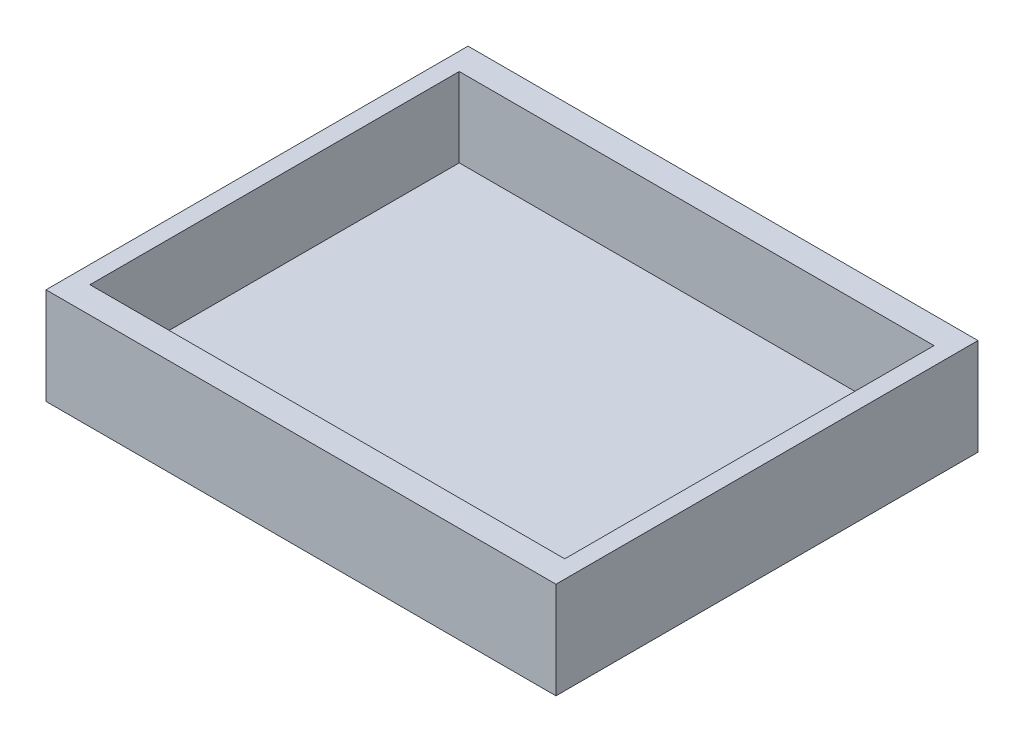
ISO-10303-21;
HEADER;
FILE_DESCRIPTION(('STEP AP214'),'2;1');
FILE_NAME('part.step','',(''),(''),'','','');
FILE_SCHEMA(('AUTOMOTIVE_DESIGN { 1 0 10303 214 1 1 1 1 }'));
ENDSEC;
DATA;
#1=APPLICATION_CONTEXT('core data for automotive mechanical design processes');
#2=APPLICATION_PROTOCOL_DEFINITION('international standard','automotive_design',2000,#1);
#3=PRODUCT_CONTEXT('',#1,'mechanical');
#4=PRODUCT('Part','Part','',(#3));
#5=PRODUCT_RELATED_PRODUCT_CATEGORY('part','',(#4));
#6=PRODUCT_DEFINITION_FORMATION('','',#4);
#7=PRODUCT_DEFINITION_CONTEXT('part definition',#1,'design');
#8=PRODUCT_DEFINITION('design','',#6,#7);
#9=PRODUCT_DEFINITION_SHAPE('','',#8);
#10=(LENGTH_UNIT() NAMED_UNIT(*) SI_UNIT(.MILLI.,.METRE.));
#11=(NAMED_UNIT(*) PLANE_ANGLE_UNIT() SI_UNIT($,.RADIAN.));
#12=(NAMED_UNIT(*) SI_UNIT($,.STERADIAN.) SOLID_ANGLE_UNIT());
#13=UNCERTAINTY_MEASURE_WITH_UNIT(LENGTH_MEASURE(1.E-05),#10,'distance_accuracy_value','');
#14=(GEOMETRIC_REPRESENTATION_CONTEXT(3) GLOBAL_UNCERTAINTY_ASSIGNED_CONTEXT((#13)) GLOBAL_UNIT_ASSIGNED_CONTEXT((#10,
#11,#12)) REPRESENTATION_CONTEXT('',''));
#15=CARTESIAN_POINT('',(0.,0.,0.));
#16=DIRECTION('',(0.,0.,1.));
#17=DIRECTION('',(1.,0.,0.));
#18=AXIS2_PLACEMENT_3D('',#15,#16,#17);
#19=CARTESIAN_POINT('',(0.,2.54,0.));
#20=DIRECTION('',(0.,-1.,0.));
#21=DIRECTION('',(0.,0.,-1.));
#22=AXIS2_PLACEMENT_3D('',#19,#20,#21);
#23=PLANE('',#22);
#24=DIRECTION('',(1.,0.,0.));
#25=VECTOR('',#24,1.);
#26=CARTESIAN_POINT('',(-34.29,2.54,26.67));
#27=LINE('',#26,#25);
#28=CARTESIAN_POINT('',(-34.29,2.54,26.67));
#29=VERTEX_POINT('',#28);
#30=CARTESIAN_POINT('',(34.29,2.54,26.67));
#31=VERTEX_POINT('',#30);
#32=EDGE_CURVE('E161',#29,#31,#27,.T.);
#33=ORIENTED_EDGE('',*,*,#32,.T.);
#34=DIRECTION('',(0.,0.,1.));
#35=VECTOR('',#34,1.);
#36=CARTESIAN_POINT('',(34.29,2.54,-26.67));
#37=LINE('',#36,#35);
#38=CARTESIAN_POINT('',(34.29,2.54,-26.67));
#39=VERTEX_POINT('',#38);
#40=EDGE_CURVE('E164',#39,#31,#37,.T.);
#41=ORIENTED_EDGE('',*,*,#40,.F.);
#42=DIRECTION('',(1.,0.,0.));
#43=VECTOR('',#42,1.);
#44=CARTESIAN_POINT('',(-34.29,2.54,-26.67));
#45=LINE('',#44,#43);
#46=CARTESIAN_POINT('',(-34.29,2.54,-26.67));
#47=VERTEX_POINT('',#46);
#48=EDGE_CURVE('E45',#47,#39,#45,.T.);
#49=ORIENTED_EDGE('',*,*,#48,.F.);
#50=DIRECTION('',(0.,0.,1.));
#51=VECTOR('',#50,1.);
#52=CARTESIAN_POINT('',(-34.29,2.54,-26.67));
#53=LINE('',#52,#51);
#54=EDGE_CURVE('E11',#47,#29,#53,.T.);
#55=ORIENTED_EDGE('',*,*,#54,.T.);
#56=EDGE_LOOP('',(#33,#41,#49,#55));
#57=FACE_BOUND('',#56,.T.);
#58=ADVANCED_FACE('F37',(#57),#23,.F.);
#59=CARTESIAN_POINT('',(34.29,13.97,-26.67));
#60=DIRECTION('',(-1.,0.,0.));
#61=DIRECTION('',(0.,0.,1.));
#62=AXIS2_PLACEMENT_3D('',#59,#60,#61);
#63=PLANE('',#62);
#64=ORIENTED_EDGE('',*,*,#40,.T.);
#65=DIRECTION('',(0.,-1.,0.));
#66=VECTOR('',#65,1.);
#67=CARTESIAN_POINT('',(34.29,13.97,26.67));
#68=LINE('',#67,#66);
#69=CARTESIAN_POINT('',(34.29,13.97,26.67));
#70=VERTEX_POINT('',#69);
#71=EDGE_CURVE('E52',#70,#31,#68,.T.);
#72=ORIENTED_EDGE('',*,*,#71,.F.);
#73=DIRECTION('',(0.,0.,-1.));
#74=VECTOR('',#73,1.);
#75=CARTESIAN_POINT('',(34.29,13.97,-26.67));
#76=LINE('',#75,#74);
#77=CARTESIAN_POINT('',(34.29,13.97,-26.67));
#78=VERTEX_POINT('',#77);
#79=EDGE_CURVE('E102',#70,#78,#76,.T.);
#80=ORIENTED_EDGE('',*,*,#79,.T.);
#81=DIRECTION('',(0.,-1.,0.));
#82=VECTOR('',#81,1.);
#83=CARTESIAN_POINT('',(34.29,13.97,-26.67));
#84=LINE('',#83,#82);
#85=EDGE_CURVE('E104',#78,#39,#84,.T.);
#86=ORIENTED_EDGE('',*,*,#85,.T.);
#87=EDGE_LOOP('',(#64,#72,#80,#86));
#88=FACE_BOUND('',#87,.T.);
#89=ADVANCED_FACE('F103',(#88),#63,.T.);
#90=CARTESIAN_POINT('',(-34.29,13.97,-26.67));
#91=DIRECTION('',(0.,0.,1.));
#92=DIRECTION('',(1.,0.,0.));
#93=AXIS2_PLACEMENT_3D('',#90,#91,#92);
#94=PLANE('',#93);
#95=ORIENTED_EDGE('',*,*,#48,.T.);
#96=ORIENTED_EDGE('',*,*,#85,.F.);
#97=DIRECTION('',(-1.,0.,0.));
#98=VECTOR('',#97,1.);
#99=CARTESIAN_POINT('',(-34.29,13.97,-26.67));
#100=LINE('',#99,#98);
#101=CARTESIAN_POINT('',(-34.29,13.97,-26.67));
#102=VERTEX_POINT('',#101);
#103=EDGE_CURVE('E109',#78,#102,#100,.T.);
#104=ORIENTED_EDGE('',*,*,#103,.T.);
#105=DIRECTION('',(0.,-1.,0.));
#106=VECTOR('',#105,1.);
#107=CARTESIAN_POINT('',(-34.29,13.97,-26.67));
#108=LINE('',#107,#106);
#109=EDGE_CURVE('E115',#102,#47,#108,.T.);
#110=ORIENTED_EDGE('',*,*,#109,.T.);
#111=EDGE_LOOP('',(#95,#96,#104,#110));
#112=FACE_BOUND('',#111,.T.);
#113=ADVANCED_FACE('F112',(#112),#94,.T.);
#114=CARTESIAN_POINT('',(-34.29,13.97,-26.67));
#115=DIRECTION('',(1.,0.,0.));
#116=DIRECTION('',(0.,0.,-1.));
#117=AXIS2_PLACEMENT_3D('',#114,#115,#116);
#118=PLANE('',#117);
#119=CARTESIAN_POINT('',(-34.29,4.318,20.32));
#120=DIRECTION('',(-1.,0.,0.));
#121=DIRECTION('',(0.,0.,1.));
#122=AXIS2_PLACEMENT_3D('',#119,#120,#121);
#123=CIRCLE('',#122,1.651);
#124=CARTESIAN_POINT('',(-34.29,4.318,21.971));
#125=VERTEX_POINT('',#124);
#126=EDGE_CURVE('E110',#125,#125,#123,.T.);
#127=ORIENTED_EDGE('',*,*,#126,.T.);
#128=EDGE_LOOP('',(#127));
#129=FACE_BOUND('',#128,.T.);
#130=ORIENTED_EDGE('',*,*,#54,.F.);
#131=ORIENTED_EDGE('',*,*,#109,.F.);
#132=DIRECTION('',(0.,0.,1.));
#133=VECTOR('',#132,1.);
#134=CARTESIAN_POINT('',(-34.29,13.97,-26.67));
#135=LINE('',#134,#133);
#136=CARTESIAN_POINT('',(-34.29,13.97,26.67));
#137=VERTEX_POINT('',#136);
#138=EDGE_CURVE('E120',#102,#137,#135,.T.);
#139=ORIENTED_EDGE('',*,*,#138,.T.);
#140=DIRECTION('',(0.,-1.,0.));
#141=VECTOR('',#140,1.);
#142=CARTESIAN_POINT('',(-34.29,13.97,26.67));
#143=LINE('',#142,#141);
#144=EDGE_CURVE('E128',#137,#29,#143,.T.);
#145=ORIENTED_EDGE('',*,*,#144,.T.);
#146=EDGE_LOOP('',(#130,#131,#139,#145));
#147=FACE_BOUND('',#146,.T.);
#148=ADVANCED_FACE('F168',(#129,#147),#118,.T.);
#149=CARTESIAN_POINT('',(-34.29,13.97,26.67));
#150=DIRECTION('',(0.,0.,-1.));
#151=DIRECTION('',(-1.,0.,0.));
#152=AXIS2_PLACEMENT_3D('',#149,#150,#151);
#153=PLANE('',#152);
#154=ORIENTED_EDGE('',*,*,#32,.F.);
#155=ORIENTED_EDGE('',*,*,#144,.F.);
#156=DIRECTION('',(1.,0.,0.));
#157=VECTOR('',#156,1.);
#158=CARTESIAN_POINT('',(-34.29,13.97,26.67));
#159=LINE('',#158,#157);
#160=EDGE_CURVE('E122',#137,#70,#159,.T.);
#161=ORIENTED_EDGE('',*,*,#160,.T.);
#162=ORIENTED_EDGE('',*,*,#71,.T.);
#163=EDGE_LOOP('',(#154,#155,#161,#162));
#164=FACE_BOUND('',#163,.T.);
#165=ADVANCED_FACE('F166',(#164),#153,.T.);
#166=CARTESIAN_POINT('',(0.,13.97,0.));
#167=DIRECTION('',(0.,1.,0.));
#168=DIRECTION('',(0.,0.,1.));
#169=AXIS2_PLACEMENT_3D('',#166,#167,#168);
#170=PLANE('',#169);
#171=DIRECTION('',(0.,0.,-1.));
#172=VECTOR('',#171,1.);
#173=CARTESIAN_POINT('',(36.83,13.97,-30.48));
#174=LINE('',#173,#172);
#175=CARTESIAN_POINT('',(36.83,13.97,30.48));
#176=VERTEX_POINT('',#175);
#177=CARTESIAN_POINT('',(36.83,13.97,-30.48));
#178=VERTEX_POINT('',#177);
#179=EDGE_CURVE('E132',#176,#178,#174,.T.);
#180=ORIENTED_EDGE('',*,*,#179,.T.);
#181=DIRECTION('',(-1.,0.,0.));
#182=VECTOR('',#181,1.);
#183=CARTESIAN_POINT('',(-36.83,13.97,-30.48));
#184=LINE('',#183,#182);
#185=CARTESIAN_POINT('',(-36.83,13.97,-30.48));
#186=VERTEX_POINT('',#185);
#187=EDGE_CURVE('E135',#178,#186,#184,.T.);
#188=ORIENTED_EDGE('',*,*,#187,.T.);
#189=DIRECTION('',(0.,0.,1.));
#190=VECTOR('',#189,1.);
#191=CARTESIAN_POINT('',(-36.83,13.97,-30.48));
#192=LINE('',#191,#190);
#193=CARTESIAN_POINT('',(-36.83,13.97,30.48));
#194=VERTEX_POINT('',#193);
#195=EDGE_CURVE('E138',#186,#194,#192,.T.);
#196=ORIENTED_EDGE('',*,*,#195,.T.);
#197=DIRECTION('',(1.,0.,0.));
#198=VECTOR('',#197,1.);
#199=CARTESIAN_POINT('',(-36.83,13.97,30.48));
#200=LINE('',#199,#198);
#201=EDGE_CURVE('E140',#194,#176,#200,.T.);
#202=ORIENTED_EDGE('',*,*,#201,.T.);
#203=EDGE_LOOP('',(#180,#188,#196,#202));
#204=FACE_BOUND('',#203,.T.);
#205=ORIENTED_EDGE('',*,*,#103,.F.);
#206=ORIENTED_EDGE('',*,*,#79,.F.);
#207=ORIENTED_EDGE('',*,*,#160,.F.);
#208=ORIENTED_EDGE('',*,*,#138,.F.);
#209=EDGE_LOOP('',(#205,#206,#207,#208));
#210=FACE_BOUND('',#209,.T.);
#211=ADVANCED_FACE('F118',(#204,#210),#170,.T.);
#212=CARTESIAN_POINT('',(36.83,13.97,-30.48));
#213=DIRECTION('',(-1.,0.,0.));
#214=DIRECTION('',(0.,0.,1.));
#215=AXIS2_PLACEMENT_3D('',#212,#213,#214);
#216=PLANE('',#215);
#217=DIRECTION('',(0.,0.,-1.));
#218=VECTOR('',#217,1.);
#219=CARTESIAN_POINT('',(36.83,0.,-30.48));
#220=LINE('',#219,#218);
#221=CARTESIAN_POINT('',(36.83,0.,30.48));
#222=VERTEX_POINT('',#221);
#223=CARTESIAN_POINT('',(36.83,0.,-30.48));
#224=VERTEX_POINT('',#223);
#225=EDGE_CURVE('E114',#222,#224,#220,.T.);
#226=ORIENTED_EDGE('',*,*,#225,.T.);
#227=DIRECTION('',(0.,-1.,0.));
#228=VECTOR('',#227,1.);
#229=CARTESIAN_POINT('',(36.83,13.97,-30.48));
#230=LINE('',#229,#228);
#231=EDGE_CURVE('E158',#178,#224,#230,.T.);
#232=ORIENTED_EDGE('',*,*,#231,.F.);
#233=ORIENTED_EDGE('',*,*,#179,.F.);
#234=DIRECTION('',(0.,-1.,0.));
#235=VECTOR('',#234,1.);
#236=CARTESIAN_POINT('',(36.83,13.97,30.48));
#237=LINE('',#236,#235);
#238=EDGE_CURVE('E142',#176,#222,#237,.T.);
#239=ORIENTED_EDGE('',*,*,#238,.T.);
#240=EDGE_LOOP('',(#226,#232,#233,#239));
#241=FACE_BOUND('',#240,.T.);
#242=ADVANCED_FACE('F185',(#241),#216,.F.);
#243=CARTESIAN_POINT('',(-36.83,13.97,-30.48));
#244=DIRECTION('',(0.,0.,1.));
#245=DIRECTION('',(1.,0.,0.));
#246=AXIS2_PLACEMENT_3D('',#243,#244,#245);
#247=PLANE('',#246);
#248=DIRECTION('',(-1.,0.,0.));
#249=VECTOR('',#248,1.);
#250=CARTESIAN_POINT('',(-36.83,0.,-30.48));
#251=LINE('',#250,#249);
#252=CARTESIAN_POINT('',(-36.83,0.,-30.48));
#253=VERTEX_POINT('',#252);
#254=EDGE_CURVE('E145',#224,#253,#251,.T.);
#255=ORIENTED_EDGE('',*,*,#254,.T.);
#256=DIRECTION('',(0.,-1.,0.));
#257=VECTOR('',#256,1.);
#258=CARTESIAN_POINT('',(-36.83,13.97,-30.48));
#259=LINE('',#258,#257);
#260=EDGE_CURVE('E155',#186,#253,#259,.T.);
#261=ORIENTED_EDGE('',*,*,#260,.F.);
#262=ORIENTED_EDGE('',*,*,#187,.F.);
#263=ORIENTED_EDGE('',*,*,#231,.T.);
#264=EDGE_LOOP('',(#255,#261,#262,#263));
#265=FACE_BOUND('',#264,.T.);
#266=ADVANCED_FACE('F188',(#265),#247,.F.);
#267=CARTESIAN_POINT('',(-36.83,13.97,-30.48));
#268=DIRECTION('',(1.,0.,0.));
#269=DIRECTION('',(0.,0.,-1.));
#270=AXIS2_PLACEMENT_3D('',#267,#268,#269);
#271=PLANE('',#270);
#272=CARTESIAN_POINT('',(-36.83,4.318,20.32));
#273=DIRECTION('',(-1.,0.,0.));
#274=DIRECTION('',(0.,0.,1.));
#275=AXIS2_PLACEMENT_3D('',#272,#273,#274);
#276=CIRCLE('',#275,1.651);
#277=CARTESIAN_POINT('',(-36.83,4.318,21.971));
#278=VERTEX_POINT('',#277);
#279=EDGE_CURVE('E230',#278,#278,#276,.T.);
#280=ORIENTED_EDGE('',*,*,#279,.F.);
#281=EDGE_LOOP('',(#280));
#282=FACE_BOUND('',#281,.T.);
#283=DIRECTION('',(0.,0.,1.));
#284=VECTOR('',#283,1.);
#285=CARTESIAN_POINT('',(-36.83,0.,-30.48));
#286=LINE('',#285,#284);
#287=CARTESIAN_POINT('',(-36.83,0.,30.48));
#288=VERTEX_POINT('',#287);
#289=EDGE_CURVE('E147',#253,#288,#286,.T.);
#290=ORIENTED_EDGE('',*,*,#289,.T.);
#291=DIRECTION('',(0.,-1.,0.));
#292=VECTOR('',#291,1.);
#293=CARTESIAN_POINT('',(-36.83,13.97,30.48));
#294=LINE('',#293,#292);
#295=EDGE_CURVE('E152',#194,#288,#294,.T.);
#296=ORIENTED_EDGE('',*,*,#295,.F.);
#297=ORIENTED_EDGE('',*,*,#195,.F.);
#298=ORIENTED_EDGE('',*,*,#260,.T.);
#299=EDGE_LOOP('',(#290,#296,#297,#298));
#300=FACE_BOUND('',#299,.T.);
#301=ADVANCED_FACE('F192',(#282,#300),#271,.F.);
#302=CARTESIAN_POINT('',(-36.83,13.97,30.48));
#303=DIRECTION('',(0.,0.,-1.));
#304=DIRECTION('',(-1.,0.,0.));
#305=AXIS2_PLACEMENT_3D('',#302,#303,#304);
#306=PLANE('',#305);
#307=DIRECTION('',(1.,0.,0.));
#308=VECTOR('',#307,1.);
#309=CARTESIAN_POINT('',(-36.83,0.,30.48));
#310=LINE('',#309,#308);
#311=EDGE_CURVE('E136',#288,#222,#310,.T.);
#312=ORIENTED_EDGE('',*,*,#311,.T.);
#313=ORIENTED_EDGE('',*,*,#238,.F.);
#314=ORIENTED_EDGE('',*,*,#201,.F.);
#315=ORIENTED_EDGE('',*,*,#295,.T.);
#316=EDGE_LOOP('',(#312,#313,#314,#315));
#317=FACE_BOUND('',#316,.T.);
#318=ADVANCED_FACE('F196',(#317),#306,.F.);
#319=CARTESIAN_POINT('',(0.,0.,0.));
#320=DIRECTION('',(0.,-1.,0.));
#321=DIRECTION('',(0.,0.,-1.));
#322=AXIS2_PLACEMENT_3D('',#319,#320,#321);
#323=PLANE('',#322);
#324=ORIENTED_EDGE('',*,*,#225,.F.);
#325=ORIENTED_EDGE('',*,*,#311,.F.);
#326=ORIENTED_EDGE('',*,*,#289,.F.);
#327=ORIENTED_EDGE('',*,*,#254,.F.);
#328=EDGE_LOOP('',(#324,#325,#326,#327));
#329=FACE_BOUND('',#328,.T.);
#330=ADVANCED_FACE('F39',(#329),#323,.T.);
#331=CARTESIAN_POINT('',(-34.29,4.318,20.32));
#332=DIRECTION('',(-1.,0.,0.));
#333=DIRECTION('',(0.,0.,1.));
#334=AXIS2_PLACEMENT_3D('',#331,#332,#333);
#335=CYLINDRICAL_SURFACE('',#334,1.651);
#336=ORIENTED_EDGE('',*,*,#126,.F.);
#337=EDGE_LOOP('',(#336));
#338=FACE_BOUND('',#337,.T.);
#339=ORIENTED_EDGE('',*,*,#279,.T.);
#340=EDGE_LOOP('',(#339));
#341=FACE_BOUND('',#340,.T.);
#342=ADVANCED_FACE('F218',(#338,#341),#335,.F.);
#343=CLOSED_SHELL('',(#58,#89,#113,#148,#165,#211,#242,#266,#301,#318,#330,#342));
#344=MANIFOLD_SOLID_BREP('B2',#343);
#345=ADVANCED_BREP_SHAPE_REPRESENTATION('',(#18,#344),#14);
#346=SHAPE_DEFINITION_REPRESENTATION(#9,#345);
ENDSEC;
END-ISO-10303-21;
